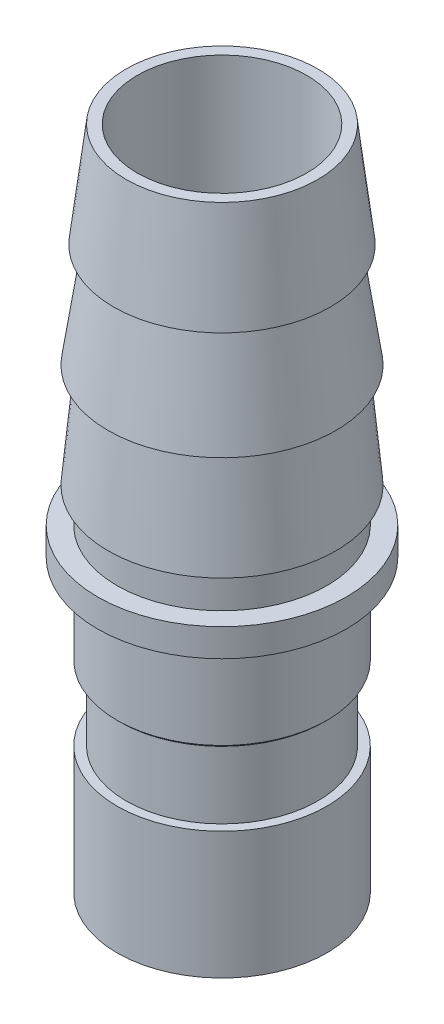
ISO-10303-21;
HEADER;
FILE_DESCRIPTION(('STEP AP214'),'2;1');
FILE_NAME('part.step','',(''),(''),'','','');
FILE_SCHEMA(('AUTOMOTIVE_DESIGN { 1 0 10303 214 1 1 1 1 }'));
ENDSEC;
DATA;
#1=APPLICATION_CONTEXT('core data for automotive mechanical design processes');
#2=APPLICATION_PROTOCOL_DEFINITION('international standard','automotive_design',2000,#1);
#3=PRODUCT_CONTEXT('',#1,'mechanical');
#4=PRODUCT('Part','Part','',(#3));
#5=PRODUCT_RELATED_PRODUCT_CATEGORY('part','',(#4));
#6=PRODUCT_DEFINITION_FORMATION('','',#4);
#7=PRODUCT_DEFINITION_CONTEXT('part definition',#1,'design');
#8=PRODUCT_DEFINITION('design','',#6,#7);
#9=PRODUCT_DEFINITION_SHAPE('','',#8);
#10=(LENGTH_UNIT() NAMED_UNIT(*) SI_UNIT(.MILLI.,.METRE.));
#11=(NAMED_UNIT(*) PLANE_ANGLE_UNIT() SI_UNIT($,.RADIAN.));
#12=(NAMED_UNIT(*) SI_UNIT($,.STERADIAN.) SOLID_ANGLE_UNIT());
#13=UNCERTAINTY_MEASURE_WITH_UNIT(LENGTH_MEASURE(1.E-05),#10,'distance_accuracy_value','');
#14=(GEOMETRIC_REPRESENTATION_CONTEXT(3) GLOBAL_UNCERTAINTY_ASSIGNED_CONTEXT((#13)) GLOBAL_UNIT_ASSIGNED_CONTEXT((#10,
#11,#12)) REPRESENTATION_CONTEXT('',''));
#15=CARTESIAN_POINT('',(0.,0.,0.));
#16=DIRECTION('',(0.,0.,1.));
#17=DIRECTION('',(1.,0.,0.));
#18=AXIS2_PLACEMENT_3D('',#15,#16,#17);
#19=CARTESIAN_POINT('',(0.,70.3957166504671,0.));
#20=DIRECTION('',(0.,1.,0.));
#21=DIRECTION('',(0.,0.,1.));
#22=AXIS2_PLACEMENT_3D('',#19,#20,#21);
#23=CYLINDRICAL_SURFACE('',#22,6.10000000000001);
#24=CARTESIAN_POINT('',(0.,52.8957166504671,0.));
#25=DIRECTION('',(0.,1.,0.));
#26=DIRECTION('',(0.,0.,1.));
#27=AXIS2_PLACEMENT_3D('',#24,#25,#26);
#28=CIRCLE('',#27,6.10000000000001);
#29=CARTESIAN_POINT('',(0.,52.8957166504671,6.10000000000001));
#30=VERTEX_POINT('',#29);
#31=EDGE_CURVE('E93',#30,#30,#28,.T.);
#32=ORIENTED_EDGE('',*,*,#31,.T.);
#33=EDGE_LOOP('',(#32));
#34=FACE_BOUND('',#33,.T.);
#35=CARTESIAN_POINT('',(0.,5.,0.));
#36=DIRECTION('',(0.,1.,0.));
#37=DIRECTION('',(0.,0.,1.));
#38=AXIS2_PLACEMENT_3D('',#35,#36,#37);
#39=CIRCLE('',#38,6.10000000000001);
#40=CARTESIAN_POINT('',(0.,5.,6.10000000000001));
#41=VERTEX_POINT('',#40);
#42=EDGE_CURVE('E10',#41,#41,#39,.T.);
#43=ORIENTED_EDGE('',*,*,#42,.F.);
#44=EDGE_LOOP('',(#43));
#45=FACE_BOUND('',#44,.T.);
#46=ADVANCED_FACE('F32',(#34,#45),#23,.F.);
#47=CARTESIAN_POINT('',(0.,5.,0.));
#48=DIRECTION('',(0.,1.,0.));
#49=DIRECTION('',(0.,0.,1.));
#50=AXIS2_PLACEMENT_3D('',#47,#48,#49);
#51=PLANE('',#50);
#52=CARTESIAN_POINT('',(0.,5.,0.));
#53=DIRECTION('',(0.,1.,0.));
#54=DIRECTION('',(0.,0.,1.));
#55=AXIS2_PLACEMENT_3D('',#52,#53,#54);
#56=CIRCLE('',#55,7.55000000000001);
#57=CARTESIAN_POINT('',(0.,5.,7.55000000000001));
#58=VERTEX_POINT('',#57);
#59=EDGE_CURVE('E38',#58,#58,#56,.T.);
#60=ORIENTED_EDGE('',*,*,#59,.F.);
#61=EDGE_LOOP('',(#60));
#62=FACE_BOUND('',#61,.T.);
#63=ORIENTED_EDGE('',*,*,#42,.T.);
#64=EDGE_LOOP('',(#63));
#65=FACE_BOUND('',#64,.T.);
#66=ADVANCED_FACE('F117',(#62,#65),#51,.F.);
#67=CARTESIAN_POINT('',(0.,70.3957166504671,0.));
#68=DIRECTION('',(0.,1.,0.));
#69=DIRECTION('',(0.,0.,1.));
#70=AXIS2_PLACEMENT_3D('',#67,#68,#69);
#71=CYLINDRICAL_SURFACE('',#70,7.55000000000001);
#72=CARTESIAN_POINT('',(0.,14.15,0.));
#73=DIRECTION('',(0.,1.,0.));
#74=DIRECTION('',(0.,0.,1.));
#75=AXIS2_PLACEMENT_3D('',#72,#73,#74);
#76=CIRCLE('',#75,7.55000000000001);
#77=CARTESIAN_POINT('',(0.,14.15,7.55000000000001));
#78=VERTEX_POINT('',#77);
#79=EDGE_CURVE('E42',#78,#78,#76,.T.);
#80=ORIENTED_EDGE('',*,*,#79,.F.);
#81=EDGE_LOOP('',(#80));
#82=FACE_BOUND('',#81,.T.);
#83=ORIENTED_EDGE('',*,*,#59,.T.);
#84=EDGE_LOOP('',(#83));
#85=FACE_BOUND('',#84,.T.);
#86=ADVANCED_FACE('F121',(#82,#85),#71,.T.);
#87=CARTESIAN_POINT('',(0.,14.15,0.));
#88=DIRECTION('',(0.,-1.,0.));
#89=DIRECTION('',(0.,0.,-1.));
#90=AXIS2_PLACEMENT_3D('',#87,#88,#89);
#91=PLANE('',#90);
#92=CARTESIAN_POINT('',(0.,14.15,0.));
#93=DIRECTION('',(0.,1.,0.));
#94=DIRECTION('',(0.,0.,1.));
#95=AXIS2_PLACEMENT_3D('',#92,#93,#94);
#96=CIRCLE('',#95,6.90000000000001);
#97=CARTESIAN_POINT('',(0.,14.15,6.90000000000001));
#98=VERTEX_POINT('',#97);
#99=EDGE_CURVE('E46',#98,#98,#96,.T.);
#100=ORIENTED_EDGE('',*,*,#99,.F.);
#101=EDGE_LOOP('',(#100));
#102=FACE_BOUND('',#101,.T.);
#103=ORIENTED_EDGE('',*,*,#79,.T.);
#104=EDGE_LOOP('',(#103));
#105=FACE_BOUND('',#104,.T.);
#106=ADVANCED_FACE('F126',(#102,#105),#91,.F.);
#107=CARTESIAN_POINT('',(0.,70.3957166504671,0.));
#108=DIRECTION('',(0.,1.,0.));
#109=DIRECTION('',(0.,0.,1.));
#110=AXIS2_PLACEMENT_3D('',#107,#108,#109);
#111=CYLINDRICAL_SURFACE('',#110,6.90000000000001);
#112=CARTESIAN_POINT('',(0.,19.3,0.));
#113=DIRECTION('',(0.,1.,0.));
#114=DIRECTION('',(0.,0.,1.));
#115=AXIS2_PLACEMENT_3D('',#112,#113,#114);
#116=CIRCLE('',#115,6.90000000000001);
#117=CARTESIAN_POINT('',(0.,19.3,6.90000000000001));
#118=VERTEX_POINT('',#117);
#119=EDGE_CURVE('E51',#118,#118,#116,.T.);
#120=ORIENTED_EDGE('',*,*,#119,.F.);
#121=EDGE_LOOP('',(#120));
#122=FACE_BOUND('',#121,.T.);
#123=ORIENTED_EDGE('',*,*,#99,.T.);
#124=EDGE_LOOP('',(#123));
#125=FACE_BOUND('',#124,.T.);
#126=ADVANCED_FACE('F132',(#122,#125),#111,.T.);
#127=CARTESIAN_POINT('',(1.48800724828233E-13,19.3,0.));
#128=DIRECTION('',(0.,1.,0.));
#129=DIRECTION('',(0.,0.,1.));
#130=AXIS2_PLACEMENT_3D('',#127,#128,#129);
#131=PLANE('',#130);
#132=CARTESIAN_POINT('',(0.,19.3,0.));
#133=DIRECTION('',(0.,1.,0.));
#134=DIRECTION('',(0.,0.,1.));
#135=AXIS2_PLACEMENT_3D('',#132,#133,#134);
#136=CIRCLE('',#135,7.35000000000001);
#137=CARTESIAN_POINT('',(0.,19.3,7.35000000000001));
#138=VERTEX_POINT('',#137);
#139=EDGE_CURVE('E54',#138,#138,#136,.T.);
#140=ORIENTED_EDGE('',*,*,#139,.F.);
#141=EDGE_LOOP('',(#140));
#142=FACE_BOUND('',#141,.T.);
#143=ORIENTED_EDGE('',*,*,#119,.T.);
#144=EDGE_LOOP('',(#143));
#145=FACE_BOUND('',#144,.T.);
#146=ADVANCED_FACE('F136',(#142,#145),#131,.F.);
#147=CARTESIAN_POINT('',(0.,19.3,0.));
#148=DIRECTION('',(0.,1.,0.));
#149=DIRECTION('',(0.,0.,1.));
#150=AXIS2_PLACEMENT_3D('',#147,#148,#149);
#151=CONICAL_SURFACE('',#150,7.35000000000001,0.78539816339745);
#152=CARTESIAN_POINT('',(0.,19.5,0.));
#153=DIRECTION('',(0.,1.,0.));
#154=DIRECTION('',(0.,0.,1.));
#155=AXIS2_PLACEMENT_3D('',#152,#153,#154);
#156=CIRCLE('',#155,7.55000000000001);
#157=CARTESIAN_POINT('',(0.,19.5,7.55000000000001));
#158=VERTEX_POINT('',#157);
#159=EDGE_CURVE('E57',#158,#158,#156,.T.);
#160=ORIENTED_EDGE('',*,*,#159,.F.);
#161=EDGE_LOOP('',(#160));
#162=FACE_BOUND('',#161,.T.);
#163=ORIENTED_EDGE('',*,*,#139,.T.);
#164=EDGE_LOOP('',(#163));
#165=FACE_BOUND('',#164,.T.);
#166=ADVANCED_FACE('F140',(#162,#165),#151,.T.);
#167=CARTESIAN_POINT('',(0.,70.3957166504671,0.));
#168=DIRECTION('',(0.,1.,0.));
#169=DIRECTION('',(0.,0.,1.));
#170=AXIS2_PLACEMENT_3D('',#167,#168,#169);
#171=CYLINDRICAL_SURFACE('',#170,7.55000000000001);
#172=CARTESIAN_POINT('',(0.,25.8957166504671,0.));
#173=DIRECTION('',(0.,1.,0.));
#174=DIRECTION('',(0.,0.,1.));
#175=AXIS2_PLACEMENT_3D('',#172,#173,#174);
#176=CIRCLE('',#175,7.55000000000001);
#177=CARTESIAN_POINT('',(0.,25.8957166504671,7.55000000000001));
#178=VERTEX_POINT('',#177);
#179=EDGE_CURVE('E60',#178,#178,#176,.T.);
#180=ORIENTED_EDGE('',*,*,#179,.F.);
#181=EDGE_LOOP('',(#180));
#182=FACE_BOUND('',#181,.T.);
#183=ORIENTED_EDGE('',*,*,#159,.T.);
#184=EDGE_LOOP('',(#183));
#185=FACE_BOUND('',#184,.T.);
#186=ADVANCED_FACE('F144',(#182,#185),#171,.T.);
#187=CARTESIAN_POINT('',(0.,25.8957166504671,0.));
#188=DIRECTION('',(0.,-1.,0.));
#189=DIRECTION('',(0.,0.,-1.));
#190=AXIS2_PLACEMENT_3D('',#187,#188,#189);
#191=PLANE('',#190);
#192=ORIENTED_EDGE('',*,*,#179,.T.);
#193=EDGE_LOOP('',(#192));
#194=FACE_BOUND('',#193,.T.);
#195=CARTESIAN_POINT('',(0.,25.8957166504671,0.));
#196=DIRECTION('',(0.,1.,0.));
#197=DIRECTION('',(0.,0.,1.));
#198=AXIS2_PLACEMENT_3D('',#195,#196,#197);
#199=CIRCLE('',#198,8.95000000000001);
#200=CARTESIAN_POINT('',(0.,25.8957166504671,8.95000000000001));
#201=VERTEX_POINT('',#200);
#202=EDGE_CURVE('E63',#201,#201,#199,.T.);
#203=ORIENTED_EDGE('',*,*,#202,.F.);
#204=EDGE_LOOP('',(#203));
#205=FACE_BOUND('',#204,.T.);
#206=ADVANCED_FACE('F148',(#194,#205),#191,.T.);
#207=CARTESIAN_POINT('',(0.,70.3957166504671,0.));
#208=DIRECTION('',(0.,1.,0.));
#209=DIRECTION('',(0.,0.,1.));
#210=AXIS2_PLACEMENT_3D('',#207,#208,#209);
#211=CYLINDRICAL_SURFACE('',#210,8.95000000000001);
#212=ORIENTED_EDGE('',*,*,#202,.T.);
#213=EDGE_LOOP('',(#212));
#214=FACE_BOUND('',#213,.T.);
#215=CARTESIAN_POINT('',(0.,27.8957166504671,0.));
#216=DIRECTION('',(0.,1.,0.));
#217=DIRECTION('',(0.,0.,1.));
#218=AXIS2_PLACEMENT_3D('',#215,#216,#217);
#219=CIRCLE('',#218,8.95000000000001);
#220=CARTESIAN_POINT('',(0.,27.8957166504671,8.95000000000001));
#221=VERTEX_POINT('',#220);
#222=EDGE_CURVE('E66',#221,#221,#219,.T.);
#223=ORIENTED_EDGE('',*,*,#222,.F.);
#224=EDGE_LOOP('',(#223));
#225=FACE_BOUND('',#224,.T.);
#226=ADVANCED_FACE('F152',(#214,#225),#211,.T.);
#227=CARTESIAN_POINT('',(0.,27.8957166504671,0.));
#228=DIRECTION('',(0.,-1.,0.));
#229=DIRECTION('',(0.,0.,-1.));
#230=AXIS2_PLACEMENT_3D('',#227,#228,#229);
#231=PLANE('',#230);
#232=CARTESIAN_POINT('',(0.,27.8957166504671,0.));
#233=DIRECTION('',(0.,1.,0.));
#234=DIRECTION('',(0.,0.,1.));
#235=AXIS2_PLACEMENT_3D('',#232,#233,#234);
#236=CIRCLE('',#235,7.55000000000001);
#237=CARTESIAN_POINT('',(0.,27.8957166504671,7.55000000000001));
#238=VERTEX_POINT('',#237);
#239=EDGE_CURVE('E69',#238,#238,#236,.T.);
#240=ORIENTED_EDGE('',*,*,#239,.F.);
#241=EDGE_LOOP('',(#240));
#242=FACE_BOUND('',#241,.T.);
#243=ORIENTED_EDGE('',*,*,#222,.T.);
#244=EDGE_LOOP('',(#243));
#245=FACE_BOUND('',#244,.T.);
#246=ADVANCED_FACE('F156',(#242,#245),#231,.F.);
#247=CARTESIAN_POINT('',(0.,70.3957166504671,0.));
#248=DIRECTION('',(0.,1.,0.));
#249=DIRECTION('',(0.,0.,1.));
#250=AXIS2_PLACEMENT_3D('',#247,#248,#249);
#251=CYLINDRICAL_SURFACE('',#250,7.55000000000001);
#252=CARTESIAN_POINT('',(0.,30.3957166504671,0.));
#253=DIRECTION('',(0.,1.,0.));
#254=DIRECTION('',(0.,0.,1.));
#255=AXIS2_PLACEMENT_3D('',#252,#253,#254);
#256=CIRCLE('',#255,7.55000000000001);
#257=CARTESIAN_POINT('',(0.,30.3957166504671,7.55000000000001));
#258=VERTEX_POINT('',#257);
#259=EDGE_CURVE('E72',#258,#258,#256,.T.);
#260=ORIENTED_EDGE('',*,*,#259,.F.);
#261=EDGE_LOOP('',(#260));
#262=FACE_BOUND('',#261,.T.);
#263=ORIENTED_EDGE('',*,*,#239,.T.);
#264=EDGE_LOOP('',(#263));
#265=FACE_BOUND('',#264,.T.);
#266=ADVANCED_FACE('F160',(#262,#265),#251,.T.);
#267=CARTESIAN_POINT('',(0.,30.3957166504671,0.));
#268=DIRECTION('',(0.,1.,0.));
#269=DIRECTION('',(0.,0.,1.));
#270=AXIS2_PLACEMENT_3D('',#267,#268,#269);
#271=PLANE('',#270);
#272=CARTESIAN_POINT('',(0.,30.3957166504671,0.));
#273=DIRECTION('',(0.,1.,0.));
#274=DIRECTION('',(0.,0.,1.));
#275=AXIS2_PLACEMENT_3D('',#272,#273,#274);
#276=CIRCLE('',#275,8.20000000000001);
#277=CARTESIAN_POINT('',(0.,30.3957166504671,8.20000000000001));
#278=VERTEX_POINT('',#277);
#279=EDGE_CURVE('E75',#278,#278,#276,.T.);
#280=ORIENTED_EDGE('',*,*,#279,.F.);
#281=EDGE_LOOP('',(#280));
#282=FACE_BOUND('',#281,.T.);
#283=ORIENTED_EDGE('',*,*,#259,.T.);
#284=EDGE_LOOP('',(#283));
#285=FACE_BOUND('',#284,.T.);
#286=ADVANCED_FACE('F164',(#282,#285),#271,.F.);
#287=CARTESIAN_POINT('',(0.,30.3957166504671,0.));
#288=DIRECTION('',(0.,-1.,0.));
#289=DIRECTION('',(0.,0.,-1.));
#290=AXIS2_PLACEMENT_3D('',#287,#288,#289);
#291=CONICAL_SURFACE('',#290,8.20000000000001,0.0930637287244181);
#292=CARTESIAN_POINT('',(0.,37.8957166504671,0.));
#293=DIRECTION('',(0.,1.,0.));
#294=DIRECTION('',(0.,0.,1.));
#295=AXIS2_PLACEMENT_3D('',#292,#293,#294);
#296=CIRCLE('',#295,7.50000000000001);
#297=CARTESIAN_POINT('',(0.,37.8957166504671,7.50000000000001));
#298=VERTEX_POINT('',#297);
#299=EDGE_CURVE('E78',#298,#298,#296,.T.);
#300=ORIENTED_EDGE('',*,*,#299,.F.);
#301=EDGE_LOOP('',(#300));
#302=FACE_BOUND('',#301,.T.);
#303=ORIENTED_EDGE('',*,*,#279,.T.);
#304=EDGE_LOOP('',(#303));
#305=FACE_BOUND('',#304,.T.);
#306=ADVANCED_FACE('F168',(#302,#305),#291,.T.);
#307=CARTESIAN_POINT('',(0.,37.8957166504671,0.));
#308=DIRECTION('',(0.,-1.,0.));
#309=DIRECTION('',(0.,0.,-1.));
#310=AXIS2_PLACEMENT_3D('',#307,#308,#309);
#311=PLANE('',#310);
#312=ORIENTED_EDGE('',*,*,#299,.T.);
#313=EDGE_LOOP('',(#312));
#314=FACE_BOUND('',#313,.T.);
#315=CARTESIAN_POINT('',(0.,37.8957166504671,0.));
#316=DIRECTION('',(0.,1.,0.));
#317=DIRECTION('',(0.,0.,1.));
#318=AXIS2_PLACEMENT_3D('',#315,#316,#317);
#319=CIRCLE('',#318,8.20000000000001);
#320=CARTESIAN_POINT('',(0.,37.8957166504671,8.20000000000001));
#321=VERTEX_POINT('',#320);
#322=EDGE_CURVE('E81',#321,#321,#319,.T.);
#323=ORIENTED_EDGE('',*,*,#322,.F.);
#324=EDGE_LOOP('',(#323));
#325=FACE_BOUND('',#324,.T.);
#326=ADVANCED_FACE('F172',(#314,#325),#311,.T.);
#327=CARTESIAN_POINT('',(0.,45.3957166504671,0.));
#328=DIRECTION('',(0.,-1.,0.));
#329=DIRECTION('',(0.,0.,-1.));
#330=AXIS2_PLACEMENT_3D('',#327,#328,#329);
#331=CONICAL_SURFACE('',#330,7.10000000000001,0.145628380570822);
#332=ORIENTED_EDGE('',*,*,#322,.T.);
#333=EDGE_LOOP('',(#332));
#334=FACE_BOUND('',#333,.T.);
#335=CARTESIAN_POINT('',(0.,45.3957166504671,0.));
#336=DIRECTION('',(0.,1.,0.));
#337=DIRECTION('',(0.,0.,1.));
#338=AXIS2_PLACEMENT_3D('',#335,#336,#337);
#339=CIRCLE('',#338,7.10000000000001);
#340=CARTESIAN_POINT('',(0.,45.3957166504671,7.10000000000001));
#341=VERTEX_POINT('',#340);
#342=EDGE_CURVE('E84',#341,#341,#339,.T.);
#343=ORIENTED_EDGE('',*,*,#342,.F.);
#344=EDGE_LOOP('',(#343));
#345=FACE_BOUND('',#344,.T.);
#346=ADVANCED_FACE('F113',(#334,#345),#331,.T.);
#347=CARTESIAN_POINT('',(0.,45.3957166504671,0.));
#348=DIRECTION('',(0.,-1.,0.));
#349=DIRECTION('',(0.,0.,-1.));
#350=AXIS2_PLACEMENT_3D('',#347,#348,#349);
#351=PLANE('',#350);
#352=ORIENTED_EDGE('',*,*,#342,.T.);
#353=EDGE_LOOP('',(#352));
#354=FACE_BOUND('',#353,.T.);
#355=CARTESIAN_POINT('',(0.,45.3957166504671,0.));
#356=DIRECTION('',(0.,1.,0.));
#357=DIRECTION('',(0.,0.,1.));
#358=AXIS2_PLACEMENT_3D('',#355,#356,#357);
#359=CIRCLE('',#358,7.80000000000001);
#360=CARTESIAN_POINT('',(0.,45.3957166504671,7.80000000000001));
#361=VERTEX_POINT('',#360);
#362=EDGE_CURVE('E87',#361,#361,#359,.T.);
#363=ORIENTED_EDGE('',*,*,#362,.F.);
#364=EDGE_LOOP('',(#363));
#365=FACE_BOUND('',#364,.T.);
#366=ADVANCED_FACE('F107',(#354,#365),#351,.T.);
#367=CARTESIAN_POINT('',(0.,52.8957166504671,0.));
#368=DIRECTION('',(0.,-1.,0.));
#369=DIRECTION('',(0.,0.,-1.));
#370=AXIS2_PLACEMENT_3D('',#367,#368,#369);
#371=CONICAL_SURFACE('',#370,6.90000000000001,0.119428926018339);
#372=ORIENTED_EDGE('',*,*,#362,.T.);
#373=EDGE_LOOP('',(#372));
#374=FACE_BOUND('',#373,.T.);
#375=CARTESIAN_POINT('',(0.,52.8957166504671,0.));
#376=DIRECTION('',(0.,1.,0.));
#377=DIRECTION('',(0.,0.,1.));
#378=AXIS2_PLACEMENT_3D('',#375,#376,#377);
#379=CIRCLE('',#378,6.90000000000001);
#380=CARTESIAN_POINT('',(0.,52.8957166504671,6.90000000000001));
#381=VERTEX_POINT('',#380);
#382=EDGE_CURVE('E90',#381,#381,#379,.T.);
#383=ORIENTED_EDGE('',*,*,#382,.F.);
#384=EDGE_LOOP('',(#383));
#385=FACE_BOUND('',#384,.T.);
#386=ADVANCED_FACE('F102',(#374,#385),#371,.T.);
#387=CARTESIAN_POINT('',(0.,52.8957166504671,0.));
#388=DIRECTION('',(0.,-1.,0.));
#389=DIRECTION('',(0.,0.,-1.));
#390=AXIS2_PLACEMENT_3D('',#387,#388,#389);
#391=PLANE('',#390);
#392=ORIENTED_EDGE('',*,*,#31,.F.);
#393=EDGE_LOOP('',(#392));
#394=FACE_BOUND('',#393,.T.);
#395=ORIENTED_EDGE('',*,*,#382,.T.);
#396=EDGE_LOOP('',(#395));
#397=FACE_BOUND('',#396,.T.);
#398=ADVANCED_FACE('F99',(#394,#397),#391,.F.);
#399=CLOSED_SHELL('',(#46,#66,#86,#106,#126,#146,#166,#186,#206,#226,#246,#266,#286,#306,#326,
#346,#366,#386,#398));
#400=MANIFOLD_SOLID_BREP('B2',#399);
#401=ADVANCED_BREP_SHAPE_REPRESENTATION('',(#18,#400),#14);
#402=SHAPE_DEFINITION_REPRESENTATION(#9,#401);
ENDSEC;
END-ISO-10303-21;
